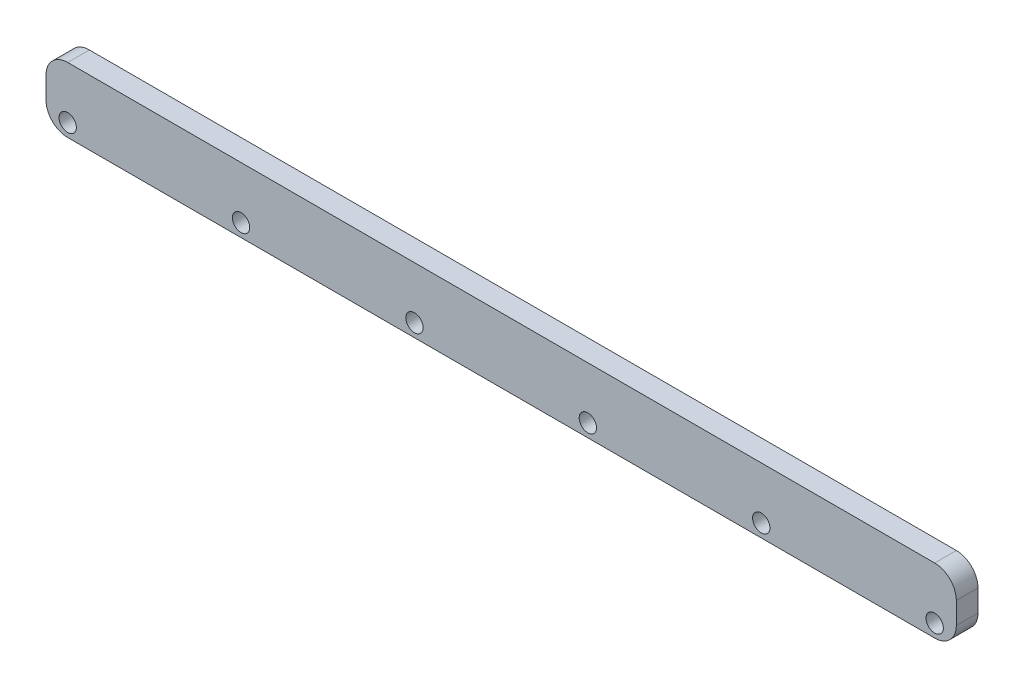
ISO-10303-21;
HEADER;
FILE_DESCRIPTION(('STEP AP214'),'2;1');
FILE_NAME('part.step','',(''),(''),'','','');
FILE_SCHEMA(('AUTOMOTIVE_DESIGN { 1 0 10303 214 1 1 1 1 }'));
ENDSEC;
DATA;
#1=APPLICATION_CONTEXT('core data for automotive mechanical design processes');
#2=APPLICATION_PROTOCOL_DEFINITION('international standard','automotive_design',2000,#1);
#3=PRODUCT_CONTEXT('',#1,'mechanical');
#4=PRODUCT('Part','Part','',(#3));
#5=PRODUCT_RELATED_PRODUCT_CATEGORY('part','',(#4));
#6=PRODUCT_DEFINITION_FORMATION('','',#4);
#7=PRODUCT_DEFINITION_CONTEXT('part definition',#1,'design');
#8=PRODUCT_DEFINITION('design','',#6,#7);
#9=PRODUCT_DEFINITION_SHAPE('','',#8);
#10=(LENGTH_UNIT() NAMED_UNIT(*) SI_UNIT(.MILLI.,.METRE.));
#11=(NAMED_UNIT(*) PLANE_ANGLE_UNIT() SI_UNIT($,.RADIAN.));
#12=(NAMED_UNIT(*) SI_UNIT($,.STERADIAN.) SOLID_ANGLE_UNIT());
#13=UNCERTAINTY_MEASURE_WITH_UNIT(LENGTH_MEASURE(1.E-05),#10,'distance_accuracy_value','');
#14=(GEOMETRIC_REPRESENTATION_CONTEXT(3) GLOBAL_UNCERTAINTY_ASSIGNED_CONTEXT((#13)) GLOBAL_UNIT_ASSIGNED_CONTEXT((#10,
#11,#12)) REPRESENTATION_CONTEXT('',''));
#15=CARTESIAN_POINT('',(0.,0.,0.));
#16=DIRECTION('',(0.,0.,1.));
#17=DIRECTION('',(1.,0.,0.));
#18=AXIS2_PLACEMENT_3D('',#15,#16,#17);
#19=CARTESIAN_POINT('',(0.,0.,5.));
#20=DIRECTION('',(0.,0.,-1.));
#21=DIRECTION('',(-1.,0.,0.));
#22=AXIS2_PLACEMENT_3D('',#19,#20,#21);
#23=PLANE('',#22);
#24=DIRECTION('',(1.,0.,0.));
#25=VECTOR('',#24,1.);
#26=CARTESIAN_POINT('',(0.,0.,5.));
#27=LINE('',#26,#25);
#28=CARTESIAN_POINT('',(5.,0.,5.));
#29=VERTEX_POINT('',#28);
#30=CARTESIAN_POINT('',(205.,0.,5.));
#31=VERTEX_POINT('',#30);
#32=EDGE_CURVE('E171',#29,#31,#27,.T.);
#33=ORIENTED_EDGE('',*,*,#32,.T.);
#34=CARTESIAN_POINT('',(205.,5.,5.));
#35=DIRECTION('',(0.,0.,-1.));
#36=DIRECTION('',(-1.,0.,0.));
#37=AXIS2_PLACEMENT_3D('',#34,#35,#36);
#38=CIRCLE('',#37,5.);
#39=CARTESIAN_POINT('',(210.,5.,5.));
#40=VERTEX_POINT('',#39);
#41=EDGE_CURVE('E148',#31,#40,#38,.F.);
#42=ORIENTED_EDGE('',*,*,#41,.T.);
#43=DIRECTION('',(0.,1.,0.));
#44=VECTOR('',#43,1.);
#45=CARTESIAN_POINT('',(210.,0.,5.));
#46=LINE('',#45,#44);
#47=CARTESIAN_POINT('',(210.,10.,5.));
#48=VERTEX_POINT('',#47);
#49=EDGE_CURVE('E118',#40,#48,#46,.T.);
#50=ORIENTED_EDGE('',*,*,#49,.T.);
#51=CARTESIAN_POINT('',(205.,10.,5.));
#52=DIRECTION('',(0.,0.,-1.));
#53=DIRECTION('',(-1.,0.,0.));
#54=AXIS2_PLACEMENT_3D('',#51,#52,#53);
#55=CIRCLE('',#54,5.);
#56=CARTESIAN_POINT('',(205.,15.,5.));
#57=VERTEX_POINT('',#56);
#58=EDGE_CURVE('E55',#48,#57,#55,.F.);
#59=ORIENTED_EDGE('',*,*,#58,.T.);
#60=DIRECTION('',(-1.,0.,0.));
#61=VECTOR('',#60,1.);
#62=CARTESIAN_POINT('',(0.,15.,5.));
#63=LINE('',#62,#61);
#64=CARTESIAN_POINT('',(5.,15.,5.));
#65=VERTEX_POINT('',#64);
#66=EDGE_CURVE('E134',#57,#65,#63,.T.);
#67=ORIENTED_EDGE('',*,*,#66,.T.);
#68=CARTESIAN_POINT('',(5.,10.,5.));
#69=DIRECTION('',(0.,0.,-1.));
#70=DIRECTION('',(-1.,0.,0.));
#71=AXIS2_PLACEMENT_3D('',#68,#69,#70);
#72=CIRCLE('',#71,5.);
#73=CARTESIAN_POINT('',(0.,10.,5.));
#74=VERTEX_POINT('',#73);
#75=EDGE_CURVE('E143',#65,#74,#72,.F.);
#76=ORIENTED_EDGE('',*,*,#75,.T.);
#77=DIRECTION('',(0.,-1.,0.));
#78=VECTOR('',#77,1.);
#79=CARTESIAN_POINT('',(0.,0.,5.));
#80=LINE('',#79,#78);
#81=CARTESIAN_POINT('',(0.,5.,5.));
#82=VERTEX_POINT('',#81);
#83=EDGE_CURVE('E128',#74,#82,#80,.T.);
#84=ORIENTED_EDGE('',*,*,#83,.T.);
#85=CARTESIAN_POINT('',(5.,5.,5.));
#86=DIRECTION('',(0.,0.,-1.));
#87=DIRECTION('',(-1.,0.,0.));
#88=AXIS2_PLACEMENT_3D('',#85,#86,#87);
#89=CIRCLE('',#88,5.);
#90=EDGE_CURVE('E145',#82,#29,#89,.F.);
#91=ORIENTED_EDGE('',*,*,#90,.T.);
#92=EDGE_LOOP('',(#33,#42,#50,#59,#67,#76,#84,#91));
#93=FACE_BOUND('',#92,.T.);
#94=CARTESIAN_POINT('',(5.,3.,5.));
#95=DIRECTION('',(0.,0.,1.));
#96=DIRECTION('',(1.,0.,0.));
#97=AXIS2_PLACEMENT_3D('',#94,#95,#96);
#98=CIRCLE('',#97,2.);
#99=CARTESIAN_POINT('',(7.,3.,5.));
#100=VERTEX_POINT('',#99);
#101=EDGE_CURVE('E164',#100,#100,#98,.T.);
#102=ORIENTED_EDGE('',*,*,#101,.F.);
#103=EDGE_LOOP('',(#102));
#104=FACE_BOUND('',#103,.T.);
#105=CARTESIAN_POINT('',(45.,3.,5.));
#106=DIRECTION('',(0.,0.,1.));
#107=DIRECTION('',(1.,0.,0.));
#108=AXIS2_PLACEMENT_3D('',#105,#106,#107);
#109=CIRCLE('',#108,2.);
#110=CARTESIAN_POINT('',(47.,3.,5.));
#111=VERTEX_POINT('',#110);
#112=EDGE_CURVE('E176',#111,#111,#109,.T.);
#113=ORIENTED_EDGE('',*,*,#112,.F.);
#114=EDGE_LOOP('',(#113));
#115=FACE_BOUND('',#114,.T.);
#116=CARTESIAN_POINT('',(85.,3.,5.));
#117=DIRECTION('',(0.,0.,1.));
#118=DIRECTION('',(1.,0.,0.));
#119=AXIS2_PLACEMENT_3D('',#116,#117,#118);
#120=CIRCLE('',#119,2.);
#121=CARTESIAN_POINT('',(87.,3.,5.));
#122=VERTEX_POINT('',#121);
#123=EDGE_CURVE('E181',#122,#122,#120,.T.);
#124=ORIENTED_EDGE('',*,*,#123,.F.);
#125=EDGE_LOOP('',(#124));
#126=FACE_BOUND('',#125,.T.);
#127=CARTESIAN_POINT('',(125.,3.,5.));
#128=DIRECTION('',(0.,0.,1.));
#129=DIRECTION('',(1.,0.,0.));
#130=AXIS2_PLACEMENT_3D('',#127,#128,#129);
#131=CIRCLE('',#130,2.);
#132=CARTESIAN_POINT('',(127.,3.,5.));
#133=VERTEX_POINT('',#132);
#134=EDGE_CURVE('E187',#133,#133,#131,.T.);
#135=ORIENTED_EDGE('',*,*,#134,.F.);
#136=EDGE_LOOP('',(#135));
#137=FACE_BOUND('',#136,.T.);
#138=CARTESIAN_POINT('',(165.,3.,5.));
#139=DIRECTION('',(0.,0.,1.));
#140=DIRECTION('',(1.,0.,0.));
#141=AXIS2_PLACEMENT_3D('',#138,#139,#140);
#142=CIRCLE('',#141,2.);
#143=CARTESIAN_POINT('',(167.,3.,5.));
#144=VERTEX_POINT('',#143);
#145=EDGE_CURVE('E193',#144,#144,#142,.T.);
#146=ORIENTED_EDGE('',*,*,#145,.F.);
#147=EDGE_LOOP('',(#146));
#148=FACE_BOUND('',#147,.T.);
#149=CARTESIAN_POINT('',(205.,3.,5.));
#150=DIRECTION('',(0.,0.,1.));
#151=DIRECTION('',(1.,0.,0.));
#152=AXIS2_PLACEMENT_3D('',#149,#150,#151);
#153=CIRCLE('',#152,2.);
#154=CARTESIAN_POINT('',(207.,3.,5.));
#155=VERTEX_POINT('',#154);
#156=EDGE_CURVE('E199',#155,#155,#153,.T.);
#157=ORIENTED_EDGE('',*,*,#156,.F.);
#158=EDGE_LOOP('',(#157));
#159=FACE_BOUND('',#158,.T.);
#160=ADVANCED_FACE('F33',(#93,#104,#115,#126,#137,#148,#159),#23,.F.);
#161=CARTESIAN_POINT('',(0.,0.,0.));
#162=DIRECTION('',(0.,0.,-1.));
#163=DIRECTION('',(-1.,0.,0.));
#164=AXIS2_PLACEMENT_3D('',#161,#162,#163);
#165=PLANE('',#164);
#166=CARTESIAN_POINT('',(165.,3.,0.));
#167=DIRECTION('',(0.,0.,1.));
#168=DIRECTION('',(1.,0.,0.));
#169=AXIS2_PLACEMENT_3D('',#166,#167,#168);
#170=CIRCLE('',#169,2.);
#171=CARTESIAN_POINT('',(167.,3.,0.));
#172=VERTEX_POINT('',#171);
#173=EDGE_CURVE('E196',#172,#172,#170,.T.);
#174=ORIENTED_EDGE('',*,*,#173,.T.);
#175=EDGE_LOOP('',(#174));
#176=FACE_BOUND('',#175,.T.);
#177=CARTESIAN_POINT('',(85.,3.,0.));
#178=DIRECTION('',(0.,0.,1.));
#179=DIRECTION('',(1.,0.,0.));
#180=AXIS2_PLACEMENT_3D('',#177,#178,#179);
#181=CIRCLE('',#180,2.);
#182=CARTESIAN_POINT('',(87.,3.,0.));
#183=VERTEX_POINT('',#182);
#184=EDGE_CURVE('E184',#183,#183,#181,.T.);
#185=ORIENTED_EDGE('',*,*,#184,.T.);
#186=EDGE_LOOP('',(#185));
#187=FACE_BOUND('',#186,.T.);
#188=CARTESIAN_POINT('',(5.,3.,0.));
#189=DIRECTION('',(0.,0.,1.));
#190=DIRECTION('',(1.,0.,0.));
#191=AXIS2_PLACEMENT_3D('',#188,#189,#190);
#192=CIRCLE('',#191,2.);
#193=CARTESIAN_POINT('',(7.,3.,0.));
#194=VERTEX_POINT('',#193);
#195=EDGE_CURVE('E166',#194,#194,#192,.T.);
#196=ORIENTED_EDGE('',*,*,#195,.T.);
#197=EDGE_LOOP('',(#196));
#198=FACE_BOUND('',#197,.T.);
#199=DIRECTION('',(0.,1.,0.));
#200=VECTOR('',#199,1.);
#201=CARTESIAN_POINT('',(210.,0.,0.));
#202=LINE('',#201,#200);
#203=CARTESIAN_POINT('',(210.,5.,0.));
#204=VERTEX_POINT('',#203);
#205=CARTESIAN_POINT('',(210.,10.,0.));
#206=VERTEX_POINT('',#205);
#207=EDGE_CURVE('E116',#204,#206,#202,.T.);
#208=ORIENTED_EDGE('',*,*,#207,.F.);
#209=CARTESIAN_POINT('',(205.,5.,0.));
#210=DIRECTION('',(0.,0.,-1.));
#211=DIRECTION('',(-1.,0.,0.));
#212=AXIS2_PLACEMENT_3D('',#209,#210,#211);
#213=CIRCLE('',#212,5.);
#214=CARTESIAN_POINT('',(205.,0.,0.));
#215=VERTEX_POINT('',#214);
#216=EDGE_CURVE('E99',#204,#215,#213,.T.);
#217=ORIENTED_EDGE('',*,*,#216,.T.);
#218=DIRECTION('',(1.,0.,0.));
#219=VECTOR('',#218,1.);
#220=CARTESIAN_POINT('',(0.,0.,0.));
#221=LINE('',#220,#219);
#222=CARTESIAN_POINT('',(5.,0.,0.));
#223=VERTEX_POINT('',#222);
#224=EDGE_CURVE('E126',#223,#215,#221,.T.);
#225=ORIENTED_EDGE('',*,*,#224,.F.);
#226=CARTESIAN_POINT('',(5.,5.,0.));
#227=DIRECTION('',(0.,0.,-1.));
#228=DIRECTION('',(-1.,0.,0.));
#229=AXIS2_PLACEMENT_3D('',#226,#227,#228);
#230=CIRCLE('',#229,5.);
#231=CARTESIAN_POINT('',(0.,5.,0.));
#232=VERTEX_POINT('',#231);
#233=EDGE_CURVE('E137',#223,#232,#230,.T.);
#234=ORIENTED_EDGE('',*,*,#233,.T.);
#235=DIRECTION('',(0.,-1.,0.));
#236=VECTOR('',#235,1.);
#237=CARTESIAN_POINT('',(0.,0.,0.));
#238=LINE('',#237,#236);
#239=CARTESIAN_POINT('',(0.,10.,0.));
#240=VERTEX_POINT('',#239);
#241=EDGE_CURVE('E130',#240,#232,#238,.T.);
#242=ORIENTED_EDGE('',*,*,#241,.F.);
#243=CARTESIAN_POINT('',(5.,10.,0.));
#244=DIRECTION('',(0.,0.,-1.));
#245=DIRECTION('',(-1.,0.,0.));
#246=AXIS2_PLACEMENT_3D('',#243,#244,#245);
#247=CIRCLE('',#246,5.);
#248=CARTESIAN_POINT('',(5.,15.,0.));
#249=VERTEX_POINT('',#248);
#250=EDGE_CURVE('E119',#240,#249,#247,.T.);
#251=ORIENTED_EDGE('',*,*,#250,.T.);
#252=DIRECTION('',(-1.,0.,0.));
#253=VECTOR('',#252,1.);
#254=CARTESIAN_POINT('',(0.,15.,0.));
#255=LINE('',#254,#253);
#256=CARTESIAN_POINT('',(205.,15.,0.));
#257=VERTEX_POINT('',#256);
#258=EDGE_CURVE('E125',#257,#249,#255,.T.);
#259=ORIENTED_EDGE('',*,*,#258,.F.);
#260=CARTESIAN_POINT('',(205.,10.,0.));
#261=DIRECTION('',(0.,0.,-1.));
#262=DIRECTION('',(-1.,0.,0.));
#263=AXIS2_PLACEMENT_3D('',#260,#261,#262);
#264=CIRCLE('',#263,5.);
#265=EDGE_CURVE('E110',#257,#206,#264,.T.);
#266=ORIENTED_EDGE('',*,*,#265,.T.);
#267=EDGE_LOOP('',(#208,#217,#225,#234,#242,#251,#259,#266));
#268=FACE_BOUND('',#267,.T.);
#269=CARTESIAN_POINT('',(45.,3.,0.));
#270=DIRECTION('',(0.,0.,1.));
#271=DIRECTION('',(1.,0.,0.));
#272=AXIS2_PLACEMENT_3D('',#269,#270,#271);
#273=CIRCLE('',#272,2.);
#274=CARTESIAN_POINT('',(47.,3.,0.));
#275=VERTEX_POINT('',#274);
#276=EDGE_CURVE('E178',#275,#275,#273,.T.);
#277=ORIENTED_EDGE('',*,*,#276,.T.);
#278=EDGE_LOOP('',(#277));
#279=FACE_BOUND('',#278,.T.);
#280=CARTESIAN_POINT('',(125.,3.,0.));
#281=DIRECTION('',(0.,0.,1.));
#282=DIRECTION('',(1.,0.,0.));
#283=AXIS2_PLACEMENT_3D('',#280,#281,#282);
#284=CIRCLE('',#283,2.);
#285=CARTESIAN_POINT('',(127.,3.,0.));
#286=VERTEX_POINT('',#285);
#287=EDGE_CURVE('E190',#286,#286,#284,.T.);
#288=ORIENTED_EDGE('',*,*,#287,.T.);
#289=EDGE_LOOP('',(#288));
#290=FACE_BOUND('',#289,.T.);
#291=CARTESIAN_POINT('',(205.,3.,0.));
#292=DIRECTION('',(0.,0.,1.));
#293=DIRECTION('',(1.,0.,0.));
#294=AXIS2_PLACEMENT_3D('',#291,#292,#293);
#295=CIRCLE('',#294,2.);
#296=CARTESIAN_POINT('',(207.,3.,0.));
#297=VERTEX_POINT('',#296);
#298=EDGE_CURVE('E202',#297,#297,#295,.T.);
#299=ORIENTED_EDGE('',*,*,#298,.T.);
#300=EDGE_LOOP('',(#299));
#301=FACE_BOUND('',#300,.T.);
#302=ADVANCED_FACE('F122',(#176,#187,#198,#268,#279,#290,#301),#165,.T.);
#303=CARTESIAN_POINT('',(0.,0.,5.));
#304=DIRECTION('',(1.,0.,0.));
#305=DIRECTION('',(0.,0.,-1.));
#306=AXIS2_PLACEMENT_3D('',#303,#304,#305);
#307=PLANE('',#306);
#308=ORIENTED_EDGE('',*,*,#241,.T.);
#309=DIRECTION('',(0.,0.,-1.));
#310=VECTOR('',#309,1.);
#311=CARTESIAN_POINT('',(0.,5.,5.));
#312=LINE('',#311,#310);
#313=EDGE_CURVE('E11',#232,#82,#312,.F.);
#314=ORIENTED_EDGE('',*,*,#313,.T.);
#315=ORIENTED_EDGE('',*,*,#83,.F.);
#316=DIRECTION('',(0.,0.,-1.));
#317=VECTOR('',#316,1.);
#318=CARTESIAN_POINT('',(0.,10.,5.));
#319=LINE('',#318,#317);
#320=EDGE_CURVE('E41',#74,#240,#319,.T.);
#321=ORIENTED_EDGE('',*,*,#320,.T.);
#322=EDGE_LOOP('',(#308,#314,#315,#321));
#323=FACE_BOUND('',#322,.T.);
#324=ADVANCED_FACE('F159',(#323),#307,.F.);
#325=CARTESIAN_POINT('',(0.,0.,5.));
#326=DIRECTION('',(0.,1.,0.));
#327=DIRECTION('',(0.,0.,1.));
#328=AXIS2_PLACEMENT_3D('',#325,#326,#327);
#329=PLANE('',#328);
#330=ORIENTED_EDGE('',*,*,#224,.T.);
#331=DIRECTION('',(0.,0.,-1.));
#332=VECTOR('',#331,1.);
#333=CARTESIAN_POINT('',(205.,0.,5.));
#334=LINE('',#333,#332);
#335=EDGE_CURVE('E104',#215,#31,#334,.F.);
#336=ORIENTED_EDGE('',*,*,#335,.T.);
#337=ORIENTED_EDGE('',*,*,#32,.F.);
#338=DIRECTION('',(0.,0.,-1.));
#339=VECTOR('',#338,1.);
#340=CARTESIAN_POINT('',(5.,0.,5.));
#341=LINE('',#340,#339);
#342=EDGE_CURVE('E109',#29,#223,#341,.T.);
#343=ORIENTED_EDGE('',*,*,#342,.T.);
#344=EDGE_LOOP('',(#330,#336,#337,#343));
#345=FACE_BOUND('',#344,.T.);
#346=ADVANCED_FACE('F228',(#345),#329,.F.);
#347=CARTESIAN_POINT('',(210.,0.,5.));
#348=DIRECTION('',(-1.,0.,0.));
#349=DIRECTION('',(0.,0.,1.));
#350=AXIS2_PLACEMENT_3D('',#347,#348,#349);
#351=PLANE('',#350);
#352=ORIENTED_EDGE('',*,*,#49,.F.);
#353=DIRECTION('',(0.,0.,-1.));
#354=VECTOR('',#353,1.);
#355=CARTESIAN_POINT('',(210.,5.,5.));
#356=LINE('',#355,#354);
#357=EDGE_CURVE('E103',#40,#204,#356,.T.);
#358=ORIENTED_EDGE('',*,*,#357,.T.);
#359=ORIENTED_EDGE('',*,*,#207,.T.);
#360=DIRECTION('',(0.,0.,-1.));
#361=VECTOR('',#360,1.);
#362=CARTESIAN_POINT('',(210.,10.,5.));
#363=LINE('',#362,#361);
#364=EDGE_CURVE('E120',#206,#48,#363,.F.);
#365=ORIENTED_EDGE('',*,*,#364,.T.);
#366=EDGE_LOOP('',(#352,#358,#359,#365));
#367=FACE_BOUND('',#366,.T.);
#368=ADVANCED_FACE('F115',(#367),#351,.F.);
#369=CARTESIAN_POINT('',(0.,15.,5.));
#370=DIRECTION('',(0.,-1.,0.));
#371=DIRECTION('',(0.,0.,-1.));
#372=AXIS2_PLACEMENT_3D('',#369,#370,#371);
#373=PLANE('',#372);
#374=ORIENTED_EDGE('',*,*,#66,.F.);
#375=DIRECTION('',(0.,0.,-1.));
#376=VECTOR('',#375,1.);
#377=CARTESIAN_POINT('',(205.,15.,5.));
#378=LINE('',#377,#376);
#379=EDGE_CURVE('E151',#57,#257,#378,.T.);
#380=ORIENTED_EDGE('',*,*,#379,.T.);
#381=ORIENTED_EDGE('',*,*,#258,.T.);
#382=DIRECTION('',(0.,0.,-1.));
#383=VECTOR('',#382,1.);
#384=CARTESIAN_POINT('',(5.,15.,5.));
#385=LINE('',#384,#383);
#386=EDGE_CURVE('E48',#249,#65,#385,.F.);
#387=ORIENTED_EDGE('',*,*,#386,.T.);
#388=EDGE_LOOP('',(#374,#380,#381,#387));
#389=FACE_BOUND('',#388,.T.);
#390=ADVANCED_FACE('F223',(#389),#373,.F.);
#391=CARTESIAN_POINT('',(5.,3.,5.));
#392=DIRECTION('',(0.,0.,-1.));
#393=DIRECTION('',(-1.,0.,0.));
#394=AXIS2_PLACEMENT_3D('',#391,#392,#393);
#395=CYLINDRICAL_SURFACE('',#394,2.);
#396=ORIENTED_EDGE('',*,*,#101,.T.);
#397=EDGE_LOOP('',(#396));
#398=FACE_BOUND('',#397,.T.);
#399=ORIENTED_EDGE('',*,*,#195,.F.);
#400=EDGE_LOOP('',(#399));
#401=FACE_BOUND('',#400,.T.);
#402=ADVANCED_FACE('F220',(#398,#401),#395,.F.);
#403=CARTESIAN_POINT('',(45.,3.,5.));
#404=DIRECTION('',(0.,0.,-1.));
#405=DIRECTION('',(-1.,0.,0.));
#406=AXIS2_PLACEMENT_3D('',#403,#404,#405);
#407=CYLINDRICAL_SURFACE('',#406,2.);
#408=ORIENTED_EDGE('',*,*,#112,.T.);
#409=EDGE_LOOP('',(#408));
#410=FACE_BOUND('',#409,.T.);
#411=ORIENTED_EDGE('',*,*,#276,.F.);
#412=EDGE_LOOP('',(#411));
#413=FACE_BOUND('',#412,.T.);
#414=ADVANCED_FACE('F341',(#410,#413),#407,.F.);
#415=CARTESIAN_POINT('',(85.,3.,5.));
#416=DIRECTION('',(0.,0.,-1.));
#417=DIRECTION('',(-1.,0.,0.));
#418=AXIS2_PLACEMENT_3D('',#415,#416,#417);
#419=CYLINDRICAL_SURFACE('',#418,2.);
#420=ORIENTED_EDGE('',*,*,#123,.T.);
#421=EDGE_LOOP('',(#420));
#422=FACE_BOUND('',#421,.T.);
#423=ORIENTED_EDGE('',*,*,#184,.F.);
#424=EDGE_LOOP('',(#423));
#425=FACE_BOUND('',#424,.T.);
#426=ADVANCED_FACE('F331',(#422,#425),#419,.F.);
#427=CARTESIAN_POINT('',(125.,3.,5.));
#428=DIRECTION('',(0.,0.,-1.));
#429=DIRECTION('',(-1.,0.,0.));
#430=AXIS2_PLACEMENT_3D('',#427,#428,#429);
#431=CYLINDRICAL_SURFACE('',#430,2.);
#432=ORIENTED_EDGE('',*,*,#134,.T.);
#433=EDGE_LOOP('',(#432));
#434=FACE_BOUND('',#433,.T.);
#435=ORIENTED_EDGE('',*,*,#287,.F.);
#436=EDGE_LOOP('',(#435));
#437=FACE_BOUND('',#436,.T.);
#438=ADVANCED_FACE('F321',(#434,#437),#431,.F.);
#439=CARTESIAN_POINT('',(165.,3.,5.));
#440=DIRECTION('',(0.,0.,-1.));
#441=DIRECTION('',(-1.,0.,0.));
#442=AXIS2_PLACEMENT_3D('',#439,#440,#441);
#443=CYLINDRICAL_SURFACE('',#442,2.);
#444=ORIENTED_EDGE('',*,*,#145,.T.);
#445=EDGE_LOOP('',(#444));
#446=FACE_BOUND('',#445,.T.);
#447=ORIENTED_EDGE('',*,*,#173,.F.);
#448=EDGE_LOOP('',(#447));
#449=FACE_BOUND('',#448,.T.);
#450=ADVANCED_FACE('F312',(#446,#449),#443,.F.);
#451=CARTESIAN_POINT('',(205.,3.,5.));
#452=DIRECTION('',(0.,0.,-1.));
#453=DIRECTION('',(-1.,0.,0.));
#454=AXIS2_PLACEMENT_3D('',#451,#452,#453);
#455=CYLINDRICAL_SURFACE('',#454,2.);
#456=ORIENTED_EDGE('',*,*,#156,.T.);
#457=EDGE_LOOP('',(#456));
#458=FACE_BOUND('',#457,.T.);
#459=ORIENTED_EDGE('',*,*,#298,.F.);
#460=EDGE_LOOP('',(#459));
#461=FACE_BOUND('',#460,.T.);
#462=ADVANCED_FACE('F208',(#458,#461),#455,.F.);
#463=CARTESIAN_POINT('',(205.,5.,5.));
#464=DIRECTION('',(0.,0.,-1.));
#465=DIRECTION('',(-1.,0.,0.));
#466=AXIS2_PLACEMENT_3D('',#463,#464,#465);
#467=CYLINDRICAL_SURFACE('',#466,5.);
#468=ORIENTED_EDGE('',*,*,#41,.F.);
#469=ORIENTED_EDGE('',*,*,#335,.F.);
#470=ORIENTED_EDGE('',*,*,#216,.F.);
#471=ORIENTED_EDGE('',*,*,#357,.F.);
#472=EDGE_LOOP('',(#468,#469,#470,#471));
#473=FACE_BOUND('',#472,.T.);
#474=ADVANCED_FACE('F102',(#473),#467,.T.);
#475=CARTESIAN_POINT('',(205.,10.,5.));
#476=DIRECTION('',(0.,0.,-1.));
#477=DIRECTION('',(-1.,0.,0.));
#478=AXIS2_PLACEMENT_3D('',#475,#476,#477);
#479=CYLINDRICAL_SURFACE('',#478,5.);
#480=ORIENTED_EDGE('',*,*,#58,.F.);
#481=ORIENTED_EDGE('',*,*,#364,.F.);
#482=ORIENTED_EDGE('',*,*,#265,.F.);
#483=ORIENTED_EDGE('',*,*,#379,.F.);
#484=EDGE_LOOP('',(#480,#481,#482,#483));
#485=FACE_BOUND('',#484,.T.);
#486=ADVANCED_FACE('F236',(#485),#479,.T.);
#487=CARTESIAN_POINT('',(5.,5.,5.));
#488=DIRECTION('',(0.,0.,-1.));
#489=DIRECTION('',(-1.,0.,0.));
#490=AXIS2_PLACEMENT_3D('',#487,#488,#489);
#491=CYLINDRICAL_SURFACE('',#490,5.);
#492=ORIENTED_EDGE('',*,*,#90,.F.);
#493=ORIENTED_EDGE('',*,*,#313,.F.);
#494=ORIENTED_EDGE('',*,*,#233,.F.);
#495=ORIENTED_EDGE('',*,*,#342,.F.);
#496=EDGE_LOOP('',(#492,#493,#494,#495));
#497=FACE_BOUND('',#496,.T.);
#498=ADVANCED_FACE('F238',(#497),#491,.T.);
#499=CARTESIAN_POINT('',(5.,10.,5.));
#500=DIRECTION('',(0.,0.,-1.));
#501=DIRECTION('',(-1.,0.,0.));
#502=AXIS2_PLACEMENT_3D('',#499,#500,#501);
#503=CYLINDRICAL_SURFACE('',#502,5.);
#504=ORIENTED_EDGE('',*,*,#75,.F.);
#505=ORIENTED_EDGE('',*,*,#386,.F.);
#506=ORIENTED_EDGE('',*,*,#250,.F.);
#507=ORIENTED_EDGE('',*,*,#320,.F.);
#508=EDGE_LOOP('',(#504,#505,#506,#507));
#509=FACE_BOUND('',#508,.T.);
#510=ADVANCED_FACE('F35',(#509),#503,.T.);
#511=CLOSED_SHELL('',(#160,#302,#324,#346,#368,#390,#402,#414,#426,#438,#450,#462,#474,#486,
#498,#510));
#512=MANIFOLD_SOLID_BREP('B2',#511);
#513=ADVANCED_BREP_SHAPE_REPRESENTATION('',(#18,#512),#14);
#514=SHAPE_DEFINITION_REPRESENTATION(#9,#513);
ENDSEC;
END-ISO-10303-21;
